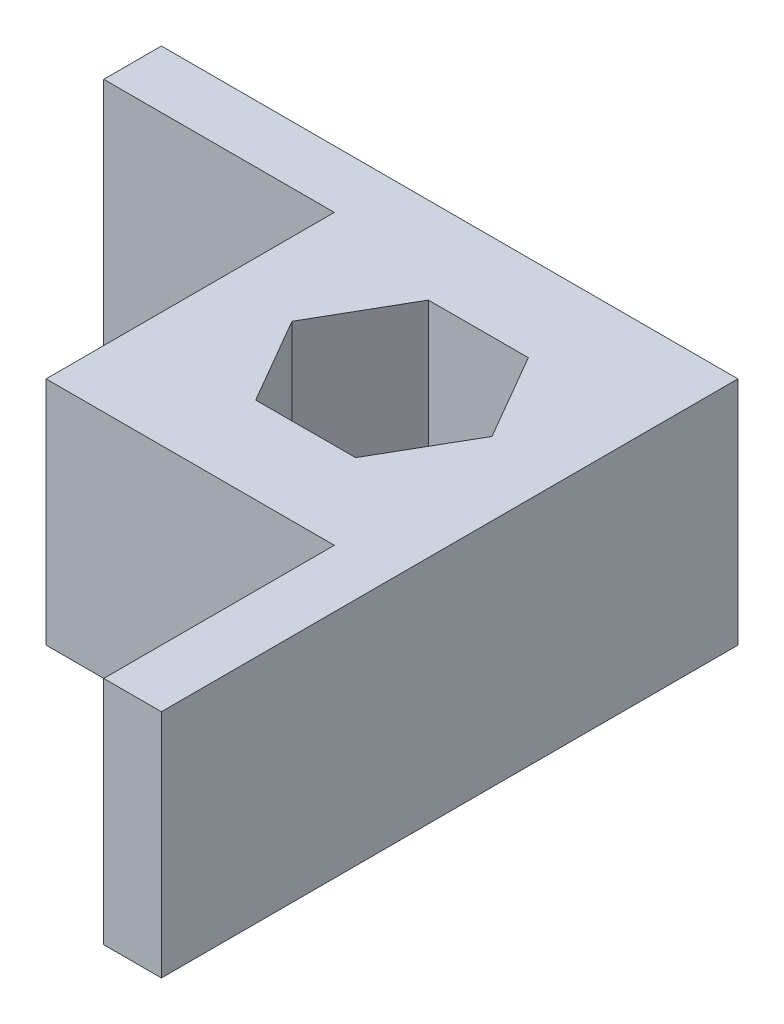
ISO-10303-21;
HEADER;
FILE_DESCRIPTION(('STEP AP214'),'2;1');
FILE_NAME('part.step','',(''),(''),'','','');
FILE_SCHEMA(('AUTOMOTIVE_DESIGN { 1 0 10303 214 1 1 1 1 }'));
ENDSEC;
DATA;
#1=APPLICATION_CONTEXT('core data for automotive mechanical design processes');
#2=APPLICATION_PROTOCOL_DEFINITION('international standard','automotive_design',2000,#1);
#3=PRODUCT_CONTEXT('',#1,'mechanical');
#4=PRODUCT('Part','Part','',(#3));
#5=PRODUCT_RELATED_PRODUCT_CATEGORY('part','',(#4));
#6=PRODUCT_DEFINITION_FORMATION('','',#4);
#7=PRODUCT_DEFINITION_CONTEXT('part definition',#1,'design');
#8=PRODUCT_DEFINITION('design','',#6,#7);
#9=PRODUCT_DEFINITION_SHAPE('','',#8);
#10=(LENGTH_UNIT() NAMED_UNIT(*) SI_UNIT(.MILLI.,.METRE.));
#11=(NAMED_UNIT(*) PLANE_ANGLE_UNIT() SI_UNIT($,.RADIAN.));
#12=(NAMED_UNIT(*) SI_UNIT($,.STERADIAN.) SOLID_ANGLE_UNIT());
#13=UNCERTAINTY_MEASURE_WITH_UNIT(LENGTH_MEASURE(1.E-05),#10,'distance_accuracy_value','');
#14=(GEOMETRIC_REPRESENTATION_CONTEXT(3) GLOBAL_UNCERTAINTY_ASSIGNED_CONTEXT((#13)) GLOBAL_UNIT_ASSIGNED_CONTEXT((#10,
#11,#12)) REPRESENTATION_CONTEXT('',''));
#15=CARTESIAN_POINT('',(0.,0.,0.));
#16=DIRECTION('',(0.,0.,1.));
#17=DIRECTION('',(1.,0.,0.));
#18=AXIS2_PLACEMENT_3D('',#15,#16,#17);
#19=CARTESIAN_POINT('',(0.,20.,5.));
#20=DIRECTION('',(1.,0.,0.));
#21=DIRECTION('',(0.,0.,-1.));
#22=AXIS2_PLACEMENT_3D('',#19,#20,#21);
#23=PLANE('',#22);
#24=DIRECTION('',(0.,0.,1.));
#25=VECTOR('',#24,1.);
#26=CARTESIAN_POINT('',(0.,0.,5.));
#27=LINE('',#26,#25);
#28=CARTESIAN_POINT('',(0.,0.,0.));
#29=VERTEX_POINT('',#28);
#30=CARTESIAN_POINT('',(0.,0.,5.));
#31=VERTEX_POINT('',#30);
#32=EDGE_CURVE('E199',#29,#31,#27,.T.);
#33=ORIENTED_EDGE('',*,*,#32,.T.);
#34=DIRECTION('',(0.,-1.,0.));
#35=VECTOR('',#34,1.);
#36=CARTESIAN_POINT('',(0.,20.,5.));
#37=LINE('',#36,#35);
#38=CARTESIAN_POINT('',(0.,20.,5.));
#39=VERTEX_POINT('',#38);
#40=EDGE_CURVE('E11',#39,#31,#37,.T.);
#41=ORIENTED_EDGE('',*,*,#40,.F.);
#42=DIRECTION('',(0.,0.,1.));
#43=VECTOR('',#42,1.);
#44=CARTESIAN_POINT('',(0.,20.,5.));
#45=LINE('',#44,#43);
#46=CARTESIAN_POINT('',(0.,20.,0.));
#47=VERTEX_POINT('',#46);
#48=EDGE_CURVE('E211',#47,#39,#45,.T.);
#49=ORIENTED_EDGE('',*,*,#48,.F.);
#50=DIRECTION('',(0.,-1.,0.));
#51=VECTOR('',#50,1.);
#52=CARTESIAN_POINT('',(0.,20.,0.));
#53=LINE('',#52,#51);
#54=EDGE_CURVE('E237',#47,#29,#53,.T.);
#55=ORIENTED_EDGE('',*,*,#54,.T.);
#56=EDGE_LOOP('',(#33,#41,#49,#55));
#57=FACE_BOUND('',#56,.T.);
#58=ADVANCED_FACE('F39',(#57),#23,.F.);
#59=CARTESIAN_POINT('',(20.,20.,5.));
#60=DIRECTION('',(0.,0.,-1.));
#61=DIRECTION('',(-1.,0.,0.));
#62=AXIS2_PLACEMENT_3D('',#59,#60,#61);
#63=PLANE('',#62);
#64=DIRECTION('',(1.,0.,0.));
#65=VECTOR('',#64,1.);
#66=CARTESIAN_POINT('',(20.,0.,5.));
#67=LINE('',#66,#65);
#68=CARTESIAN_POINT('',(20.,0.,5.));
#69=VERTEX_POINT('',#68);
#70=EDGE_CURVE('E241',#31,#69,#67,.T.);
#71=ORIENTED_EDGE('',*,*,#70,.T.);
#72=DIRECTION('',(0.,-1.,0.));
#73=VECTOR('',#72,1.);
#74=CARTESIAN_POINT('',(20.,20.,5.));
#75=LINE('',#74,#73);
#76=CARTESIAN_POINT('',(20.,20.,5.));
#77=VERTEX_POINT('',#76);
#78=EDGE_CURVE('E47',#77,#69,#75,.T.);
#79=ORIENTED_EDGE('',*,*,#78,.F.);
#80=DIRECTION('',(1.,0.,0.));
#81=VECTOR('',#80,1.);
#82=CARTESIAN_POINT('',(20.,20.,5.));
#83=LINE('',#82,#81);
#84=EDGE_CURVE('E215',#39,#77,#83,.T.);
#85=ORIENTED_EDGE('',*,*,#84,.F.);
#86=ORIENTED_EDGE('',*,*,#40,.T.);
#87=EDGE_LOOP('',(#71,#79,#85,#86));
#88=FACE_BOUND('',#87,.T.);
#89=ADVANCED_FACE('F310',(#88),#63,.F.);
#90=CARTESIAN_POINT('',(20.,20.,30.));
#91=DIRECTION('',(1.,0.,0.));
#92=DIRECTION('',(0.,0.,-1.));
#93=AXIS2_PLACEMENT_3D('',#90,#91,#92);
#94=PLANE('',#93);
#95=DIRECTION('',(0.,0.,1.));
#96=VECTOR('',#95,1.);
#97=CARTESIAN_POINT('',(20.,0.,30.));
#98=LINE('',#97,#96);
#99=CARTESIAN_POINT('',(20.,0.,30.));
#100=VERTEX_POINT('',#99);
#101=EDGE_CURVE('E244',#69,#100,#98,.T.);
#102=ORIENTED_EDGE('',*,*,#101,.T.);
#103=DIRECTION('',(0.,-1.,0.));
#104=VECTOR('',#103,1.);
#105=CARTESIAN_POINT('',(20.,20.,30.));
#106=LINE('',#105,#104);
#107=CARTESIAN_POINT('',(20.,20.,30.));
#108=VERTEX_POINT('',#107);
#109=EDGE_CURVE('E280',#108,#100,#106,.T.);
#110=ORIENTED_EDGE('',*,*,#109,.F.);
#111=DIRECTION('',(0.,0.,1.));
#112=VECTOR('',#111,1.);
#113=CARTESIAN_POINT('',(20.,20.,30.));
#114=LINE('',#113,#112);
#115=EDGE_CURVE('E219',#77,#108,#114,.T.);
#116=ORIENTED_EDGE('',*,*,#115,.F.);
#117=ORIENTED_EDGE('',*,*,#78,.T.);
#118=EDGE_LOOP('',(#102,#110,#116,#117));
#119=FACE_BOUND('',#118,.T.);
#120=ADVANCED_FACE('F289',(#119),#94,.F.);
#121=CARTESIAN_POINT('',(45.,20.,30.));
#122=DIRECTION('',(0.,0.,-1.));
#123=DIRECTION('',(-1.,0.,0.));
#124=AXIS2_PLACEMENT_3D('',#121,#122,#123);
#125=PLANE('',#124);
#126=DIRECTION('',(1.,0.,0.));
#127=VECTOR('',#126,1.);
#128=CARTESIAN_POINT('',(45.,0.,30.));
#129=LINE('',#128,#127);
#130=CARTESIAN_POINT('',(45.,0.,30.));
#131=VERTEX_POINT('',#130);
#132=EDGE_CURVE('E247',#100,#131,#129,.T.);
#133=ORIENTED_EDGE('',*,*,#132,.T.);
#134=DIRECTION('',(0.,-1.,0.));
#135=VECTOR('',#134,1.);
#136=CARTESIAN_POINT('',(45.,20.,30.));
#137=LINE('',#136,#135);
#138=CARTESIAN_POINT('',(45.,20.,30.));
#139=VERTEX_POINT('',#138);
#140=EDGE_CURVE('E276',#139,#131,#137,.T.);
#141=ORIENTED_EDGE('',*,*,#140,.F.);
#142=DIRECTION('',(1.,0.,0.));
#143=VECTOR('',#142,1.);
#144=CARTESIAN_POINT('',(45.,20.,30.));
#145=LINE('',#144,#143);
#146=EDGE_CURVE('E222',#108,#139,#145,.T.);
#147=ORIENTED_EDGE('',*,*,#146,.F.);
#148=ORIENTED_EDGE('',*,*,#109,.T.);
#149=EDGE_LOOP('',(#133,#141,#147,#148));
#150=FACE_BOUND('',#149,.T.);
#151=ADVANCED_FACE('F298',(#150),#125,.F.);
#152=CARTESIAN_POINT('',(45.,20.,50.));
#153=DIRECTION('',(1.,0.,0.));
#154=DIRECTION('',(0.,0.,-1.));
#155=AXIS2_PLACEMENT_3D('',#152,#153,#154);
#156=PLANE('',#155);
#157=DIRECTION('',(0.,0.,1.));
#158=VECTOR('',#157,1.);
#159=CARTESIAN_POINT('',(45.,0.,50.));
#160=LINE('',#159,#158);
#161=CARTESIAN_POINT('',(45.,0.,50.));
#162=VERTEX_POINT('',#161);
#163=EDGE_CURVE('E250',#131,#162,#160,.T.);
#164=ORIENTED_EDGE('',*,*,#163,.T.);
#165=DIRECTION('',(0.,-1.,0.));
#166=VECTOR('',#165,1.);
#167=CARTESIAN_POINT('',(45.,20.,50.));
#168=LINE('',#167,#166);
#169=CARTESIAN_POINT('',(45.,20.,50.));
#170=VERTEX_POINT('',#169);
#171=EDGE_CURVE('E272',#170,#162,#168,.T.);
#172=ORIENTED_EDGE('',*,*,#171,.F.);
#173=DIRECTION('',(0.,0.,1.));
#174=VECTOR('',#173,1.);
#175=CARTESIAN_POINT('',(45.,20.,50.));
#176=LINE('',#175,#174);
#177=EDGE_CURVE('E225',#139,#170,#176,.T.);
#178=ORIENTED_EDGE('',*,*,#177,.F.);
#179=ORIENTED_EDGE('',*,*,#140,.T.);
#180=EDGE_LOOP('',(#164,#172,#178,#179));
#181=FACE_BOUND('',#180,.T.);
#182=ADVANCED_FACE('F302',(#181),#156,.F.);
#183=CARTESIAN_POINT('',(50.,20.,50.));
#184=DIRECTION('',(0.,0.,-1.));
#185=DIRECTION('',(-1.,0.,0.));
#186=AXIS2_PLACEMENT_3D('',#183,#184,#185);
#187=PLANE('',#186);
#188=DIRECTION('',(1.,0.,0.));
#189=VECTOR('',#188,1.);
#190=CARTESIAN_POINT('',(50.,0.,50.));
#191=LINE('',#190,#189);
#192=CARTESIAN_POINT('',(50.,0.,50.));
#193=VERTEX_POINT('',#192);
#194=EDGE_CURVE('E253',#162,#193,#191,.T.);
#195=ORIENTED_EDGE('',*,*,#194,.T.);
#196=DIRECTION('',(0.,-1.,0.));
#197=VECTOR('',#196,1.);
#198=CARTESIAN_POINT('',(50.,20.,50.));
#199=LINE('',#198,#197);
#200=CARTESIAN_POINT('',(50.,20.,50.));
#201=VERTEX_POINT('',#200);
#202=EDGE_CURVE('E268',#201,#193,#199,.T.);
#203=ORIENTED_EDGE('',*,*,#202,.F.);
#204=DIRECTION('',(1.,0.,0.));
#205=VECTOR('',#204,1.);
#206=CARTESIAN_POINT('',(50.,20.,50.));
#207=LINE('',#206,#205);
#208=EDGE_CURVE('E228',#170,#201,#207,.T.);
#209=ORIENTED_EDGE('',*,*,#208,.F.);
#210=ORIENTED_EDGE('',*,*,#171,.T.);
#211=EDGE_LOOP('',(#195,#203,#209,#210));
#212=FACE_BOUND('',#211,.T.);
#213=ADVANCED_FACE('F323',(#212),#187,.F.);
#214=CARTESIAN_POINT('',(50.,20.,0.));
#215=DIRECTION('',(-1.,0.,0.));
#216=DIRECTION('',(0.,0.,1.));
#217=AXIS2_PLACEMENT_3D('',#214,#215,#216);
#218=PLANE('',#217);
#219=DIRECTION('',(0.,0.,-1.));
#220=VECTOR('',#219,1.);
#221=CARTESIAN_POINT('',(50.,0.,0.));
#222=LINE('',#221,#220);
#223=CARTESIAN_POINT('',(50.,0.,0.));
#224=VERTEX_POINT('',#223);
#225=EDGE_CURVE('E256',#193,#224,#222,.T.);
#226=ORIENTED_EDGE('',*,*,#225,.T.);
#227=DIRECTION('',(0.,-1.,0.));
#228=VECTOR('',#227,1.);
#229=CARTESIAN_POINT('',(50.,20.,0.));
#230=LINE('',#229,#228);
#231=CARTESIAN_POINT('',(50.,20.,0.));
#232=VERTEX_POINT('',#231);
#233=EDGE_CURVE('E264',#232,#224,#230,.T.);
#234=ORIENTED_EDGE('',*,*,#233,.F.);
#235=DIRECTION('',(0.,0.,-1.));
#236=VECTOR('',#235,1.);
#237=CARTESIAN_POINT('',(50.,20.,0.));
#238=LINE('',#237,#236);
#239=EDGE_CURVE('E231',#201,#232,#238,.T.);
#240=ORIENTED_EDGE('',*,*,#239,.F.);
#241=ORIENTED_EDGE('',*,*,#202,.T.);
#242=EDGE_LOOP('',(#226,#234,#240,#241));
#243=FACE_BOUND('',#242,.T.);
#244=ADVANCED_FACE('F321',(#243),#218,.F.);
#245=CARTESIAN_POINT('',(0.,20.,0.));
#246=DIRECTION('',(0.,0.,1.));
#247=DIRECTION('',(1.,0.,0.));
#248=AXIS2_PLACEMENT_3D('',#245,#246,#247);
#249=PLANE('',#248);
#250=DIRECTION('',(-1.,0.,0.));
#251=VECTOR('',#250,1.);
#252=CARTESIAN_POINT('',(0.,0.,0.));
#253=LINE('',#252,#251);
#254=EDGE_CURVE('E216',#224,#29,#253,.T.);
#255=ORIENTED_EDGE('',*,*,#254,.T.);
#256=ORIENTED_EDGE('',*,*,#54,.F.);
#257=DIRECTION('',(-1.,0.,0.));
#258=VECTOR('',#257,1.);
#259=CARTESIAN_POINT('',(0.,20.,0.));
#260=LINE('',#259,#258);
#261=EDGE_CURVE('E234',#232,#47,#260,.T.);
#262=ORIENTED_EDGE('',*,*,#261,.F.);
#263=ORIENTED_EDGE('',*,*,#233,.T.);
#264=EDGE_LOOP('',(#255,#256,#262,#263));
#265=FACE_BOUND('',#264,.T.);
#266=ADVANCED_FACE('F316',(#265),#249,.F.);
#267=CARTESIAN_POINT('',(0.,20.,0.));
#268=DIRECTION('',(0.,-1.,0.));
#269=DIRECTION('',(0.,0.,-1.));
#270=AXIS2_PLACEMENT_3D('',#267,#268,#269);
#271=PLANE('',#270);
#272=DIRECTION('',(0.498715571278608,0.,-0.86676570015446));
#273=VECTOR('',#272,1.);
#274=CARTESIAN_POINT('',(39.3412409812078,20.,22.4935723619034));
#275=LINE('',#274,#273);
#276=CARTESIAN_POINT('',(39.3412409812077,20.,22.4935723619034));
#277=VERTEX_POINT('',#276);
#278=CARTESIAN_POINT('',(43.6602445211092,20.,14.9871612072757));
#279=VERTEX_POINT('',#278);
#280=EDGE_CURVE('E182',#277,#279,#275,.T.);
#281=ORIENTED_EDGE('',*,*,#280,.F.);
#282=DIRECTION('',(0.999998901102072,0.,-0.00148249608708693));
#283=VECTOR('',#282,1.);
#284=CARTESIAN_POINT('',(30.6809964600986,20.,22.5064111546277));
#285=LINE('',#284,#283);
#286=CARTESIAN_POINT('',(30.6809964600986,20.,22.5064111546277));
#287=VERTEX_POINT('',#286);
#288=EDGE_CURVE('E54',#287,#277,#285,.T.);
#289=ORIENTED_EDGE('',*,*,#288,.F.);
#290=DIRECTION('',(0.501283329823464,0.,0.865283204067373));
#291=VECTOR('',#290,1.);
#292=CARTESIAN_POINT('',(26.3397554788908,20.,15.0128387927243));
#293=LINE('',#292,#291);
#294=CARTESIAN_POINT('',(26.3397554788908,20.,15.0128387927243));
#295=VERTEX_POINT('',#294);
#296=EDGE_CURVE('E162',#295,#287,#293,.T.);
#297=ORIENTED_EDGE('',*,*,#296,.F.);
#298=DIRECTION('',(-0.498715571278608,0.,0.86676570015446));
#299=VECTOR('',#298,1.);
#300=CARTESIAN_POINT('',(30.6587590187922,20.,7.50642763809656));
#301=LINE('',#300,#299);
#302=CARTESIAN_POINT('',(30.6587590187922,20.,7.50642763809656));
#303=VERTEX_POINT('',#302);
#304=EDGE_CURVE('E166',#303,#295,#301,.T.);
#305=ORIENTED_EDGE('',*,*,#304,.F.);
#306=DIRECTION('',(-0.999998901102072,0.,0.00148249608708653));
#307=VECTOR('',#306,1.);
#308=CARTESIAN_POINT('',(39.3190035399015,20.,7.49358884537228));
#309=LINE('',#308,#307);
#310=CARTESIAN_POINT('',(39.3190035399015,20.,7.49358884537228));
#311=VERTEX_POINT('',#310);
#312=EDGE_CURVE('E189',#311,#303,#309,.T.);
#313=ORIENTED_EDGE('',*,*,#312,.F.);
#314=DIRECTION('',(-0.501283329823464,0.,-0.865283204067373));
#315=VECTOR('',#314,1.);
#316=CARTESIAN_POINT('',(43.6602445211092,20.,14.9871612072757));
#317=LINE('',#316,#315);
#318=EDGE_CURVE('E185',#279,#311,#317,.T.);
#319=ORIENTED_EDGE('',*,*,#318,.F.);
#320=EDGE_LOOP('',(#281,#289,#297,#305,#313,#319));
#321=FACE_BOUND('',#320,.T.);
#322=ORIENTED_EDGE('',*,*,#48,.T.);
#323=ORIENTED_EDGE('',*,*,#84,.T.);
#324=ORIENTED_EDGE('',*,*,#115,.T.);
#325=ORIENTED_EDGE('',*,*,#146,.T.);
#326=ORIENTED_EDGE('',*,*,#177,.T.);
#327=ORIENTED_EDGE('',*,*,#208,.T.);
#328=ORIENTED_EDGE('',*,*,#239,.T.);
#329=ORIENTED_EDGE('',*,*,#261,.T.);
#330=EDGE_LOOP('',(#322,#323,#324,#325,#326,#327,#328,#329));
#331=FACE_BOUND('',#330,.T.);
#332=ADVANCED_FACE('F306',(#321,#331),#271,.F.);
#333=CARTESIAN_POINT('',(0.,0.,0.));
#334=DIRECTION('',(0.,-1.,0.));
#335=DIRECTION('',(0.,0.,-1.));
#336=AXIS2_PLACEMENT_3D('',#333,#334,#335);
#337=PLANE('',#336);
#338=DIRECTION('',(0.999998901102072,0.,-0.00148249608708693));
#339=VECTOR('',#338,1.);
#340=CARTESIAN_POINT('',(30.6809964600986,0.,22.5064111546277));
#341=LINE('',#340,#339);
#342=CARTESIAN_POINT('',(30.6809964600986,0.,22.5064111546277));
#343=VERTEX_POINT('',#342);
#344=CARTESIAN_POINT('',(39.3412409812078,0.,22.4935723619034));
#345=VERTEX_POINT('',#344);
#346=EDGE_CURVE('E142',#343,#345,#341,.T.);
#347=ORIENTED_EDGE('',*,*,#346,.T.);
#348=DIRECTION('',(0.498715571278608,0.,-0.86676570015446));
#349=VECTOR('',#348,1.);
#350=CARTESIAN_POINT('',(39.3412409812078,0.,22.4935723619034));
#351=LINE('',#350,#349);
#352=CARTESIAN_POINT('',(43.6602445211092,0.,14.9871612072757));
#353=VERTEX_POINT('',#352);
#354=EDGE_CURVE('E152',#345,#353,#351,.T.);
#355=ORIENTED_EDGE('',*,*,#354,.T.);
#356=DIRECTION('',(-0.501283329823464,0.,-0.865283204067373));
#357=VECTOR('',#356,1.);
#358=CARTESIAN_POINT('',(43.6602445211092,0.,14.9871612072757));
#359=LINE('',#358,#357);
#360=CARTESIAN_POINT('',(39.3190035399015,0.,7.49358884537228));
#361=VERTEX_POINT('',#360);
#362=EDGE_CURVE('E62',#353,#361,#359,.T.);
#363=ORIENTED_EDGE('',*,*,#362,.T.);
#364=DIRECTION('',(-0.999998901102072,0.,0.00148249608708653));
#365=VECTOR('',#364,1.);
#366=CARTESIAN_POINT('',(39.3190035399015,0.,7.49358884537228));
#367=LINE('',#366,#365);
#368=CARTESIAN_POINT('',(30.6587590187922,0.,7.50642763809656));
#369=VERTEX_POINT('',#368);
#370=EDGE_CURVE('E171',#361,#369,#367,.T.);
#371=ORIENTED_EDGE('',*,*,#370,.T.);
#372=DIRECTION('',(-0.498715571278608,0.,0.86676570015446));
#373=VECTOR('',#372,1.);
#374=CARTESIAN_POINT('',(30.6587590187922,0.,7.50642763809656));
#375=LINE('',#374,#373);
#376=CARTESIAN_POINT('',(26.3397554788908,0.,15.0128387927243));
#377=VERTEX_POINT('',#376);
#378=EDGE_CURVE('E175',#369,#377,#375,.T.);
#379=ORIENTED_EDGE('',*,*,#378,.T.);
#380=DIRECTION('',(0.501283329823464,0.,0.865283204067373));
#381=VECTOR('',#380,1.);
#382=CARTESIAN_POINT('',(26.3397554788908,0.,15.0128387927243));
#383=LINE('',#382,#381);
#384=EDGE_CURVE('E149',#377,#343,#383,.T.);
#385=ORIENTED_EDGE('',*,*,#384,.T.);
#386=EDGE_LOOP('',(#347,#355,#363,#371,#379,#385));
#387=FACE_BOUND('',#386,.T.);
#388=ORIENTED_EDGE('',*,*,#32,.F.);
#389=ORIENTED_EDGE('',*,*,#254,.F.);
#390=ORIENTED_EDGE('',*,*,#225,.F.);
#391=ORIENTED_EDGE('',*,*,#194,.F.);
#392=ORIENTED_EDGE('',*,*,#163,.F.);
#393=ORIENTED_EDGE('',*,*,#132,.F.);
#394=ORIENTED_EDGE('',*,*,#101,.F.);
#395=ORIENTED_EDGE('',*,*,#70,.F.);
#396=EDGE_LOOP('',(#388,#389,#390,#391,#392,#393,#394,#395));
#397=FACE_BOUND('',#396,.T.);
#398=ADVANCED_FACE('F157',(#387,#397),#337,.T.);
#399=CARTESIAN_POINT('',(30.6809964600986,0.,22.5064111546277));
#400=DIRECTION('',(0.00148249608708693,0.,0.999998901102072));
#401=DIRECTION('',(0.999998901102072,0.,-0.00148249608708693));
#402=AXIS2_PLACEMENT_3D('',#399,#400,#401);
#403=PLANE('',#402);
#404=ORIENTED_EDGE('',*,*,#288,.T.);
#405=DIRECTION('',(0.,1.,0.));
#406=VECTOR('',#405,1.);
#407=CARTESIAN_POINT('',(39.3412409812078,0.,22.4935723619034));
#408=LINE('',#407,#406);
#409=EDGE_CURVE('E138',#345,#277,#408,.T.);
#410=ORIENTED_EDGE('',*,*,#409,.F.);
#411=ORIENTED_EDGE('',*,*,#346,.F.);
#412=DIRECTION('',(0.,1.,0.));
#413=VECTOR('',#412,1.);
#414=CARTESIAN_POINT('',(30.6809964600986,0.,22.5064111546277));
#415=LINE('',#414,#413);
#416=EDGE_CURVE('E196',#343,#287,#415,.T.);
#417=ORIENTED_EDGE('',*,*,#416,.T.);
#418=EDGE_LOOP('',(#404,#410,#411,#417));
#419=FACE_BOUND('',#418,.T.);
#420=ADVANCED_FACE('F140',(#419),#403,.F.);
#421=CARTESIAN_POINT('',(26.3397554788908,0.,15.0128387927243));
#422=DIRECTION('',(-0.865283204067374,0.,0.501283329823464));
#423=DIRECTION('',(0.501283329823464,0.,0.865283204067374));
#424=AXIS2_PLACEMENT_3D('',#421,#422,#423);
#425=PLANE('',#424);
#426=ORIENTED_EDGE('',*,*,#296,.T.);
#427=ORIENTED_EDGE('',*,*,#416,.F.);
#428=ORIENTED_EDGE('',*,*,#384,.F.);
#429=DIRECTION('',(0.,1.,0.));
#430=VECTOR('',#429,1.);
#431=CARTESIAN_POINT('',(26.3397554788908,0.,15.0128387927243));
#432=LINE('',#431,#430);
#433=EDGE_CURVE('E200',#377,#295,#432,.T.);
#434=ORIENTED_EDGE('',*,*,#433,.T.);
#435=EDGE_LOOP('',(#426,#427,#428,#434));
#436=FACE_BOUND('',#435,.T.);
#437=ADVANCED_FACE('F394',(#436),#425,.F.);
#438=CARTESIAN_POINT('',(30.6587590187922,0.,7.50642763809656));
#439=DIRECTION('',(-0.86676570015446,0.,-0.498715571278608));
#440=DIRECTION('',(-0.498715571278608,0.,0.86676570015446));
#441=AXIS2_PLACEMENT_3D('',#438,#439,#440);
#442=PLANE('',#441);
#443=ORIENTED_EDGE('',*,*,#304,.T.);
#444=ORIENTED_EDGE('',*,*,#433,.F.);
#445=ORIENTED_EDGE('',*,*,#378,.F.);
#446=DIRECTION('',(0.,1.,0.));
#447=VECTOR('',#446,1.);
#448=CARTESIAN_POINT('',(30.6587590187922,0.,7.50642763809656));
#449=LINE('',#448,#447);
#450=EDGE_CURVE('E203',#369,#303,#449,.T.);
#451=ORIENTED_EDGE('',*,*,#450,.T.);
#452=EDGE_LOOP('',(#443,#444,#445,#451));
#453=FACE_BOUND('',#452,.T.);
#454=ADVANCED_FACE('F403',(#453),#442,.F.);
#455=CARTESIAN_POINT('',(39.3190035399015,0.,7.49358884537228));
#456=DIRECTION('',(-0.00148249608708653,0.,-0.999998901102072));
#457=DIRECTION('',(-0.999998901102072,0.,0.00148249608708653));
#458=AXIS2_PLACEMENT_3D('',#455,#456,#457);
#459=PLANE('',#458);
#460=ORIENTED_EDGE('',*,*,#312,.T.);
#461=ORIENTED_EDGE('',*,*,#450,.F.);
#462=ORIENTED_EDGE('',*,*,#370,.F.);
#463=DIRECTION('',(0.,1.,0.));
#464=VECTOR('',#463,1.);
#465=CARTESIAN_POINT('',(39.3190035399015,0.,7.49358884537228));
#466=LINE('',#465,#464);
#467=EDGE_CURVE('E206',#361,#311,#466,.T.);
#468=ORIENTED_EDGE('',*,*,#467,.T.);
#469=EDGE_LOOP('',(#460,#461,#462,#468));
#470=FACE_BOUND('',#469,.T.);
#471=ADVANCED_FACE('F413',(#470),#459,.F.);
#472=CARTESIAN_POINT('',(43.6602445211092,0.,14.9871612072757));
#473=DIRECTION('',(0.865283204067373,0.,-0.501283329823464));
#474=DIRECTION('',(-0.501283329823465,0.,-0.865283204067373));
#475=AXIS2_PLACEMENT_3D('',#472,#473,#474);
#476=PLANE('',#475);
#477=ORIENTED_EDGE('',*,*,#318,.T.);
#478=ORIENTED_EDGE('',*,*,#467,.F.);
#479=ORIENTED_EDGE('',*,*,#362,.F.);
#480=DIRECTION('',(0.,1.,0.));
#481=VECTOR('',#480,1.);
#482=CARTESIAN_POINT('',(43.6602445211092,0.,14.9871612072757));
#483=LINE('',#482,#481);
#484=EDGE_CURVE('E148',#353,#279,#483,.T.);
#485=ORIENTED_EDGE('',*,*,#484,.T.);
#486=EDGE_LOOP('',(#477,#478,#479,#485));
#487=FACE_BOUND('',#486,.T.);
#488=ADVANCED_FACE('F423',(#487),#476,.F.);
#489=CARTESIAN_POINT('',(39.3412409812078,0.,22.4935723619034));
#490=DIRECTION('',(0.86676570015446,0.,0.498715571278608));
#491=DIRECTION('',(0.498715571278608,0.,-0.86676570015446));
#492=AXIS2_PLACEMENT_3D('',#489,#490,#491);
#493=PLANE('',#492);
#494=ORIENTED_EDGE('',*,*,#280,.T.);
#495=ORIENTED_EDGE('',*,*,#484,.F.);
#496=ORIENTED_EDGE('',*,*,#354,.F.);
#497=ORIENTED_EDGE('',*,*,#409,.T.);
#498=EDGE_LOOP('',(#494,#495,#496,#497));
#499=FACE_BOUND('',#498,.T.);
#500=ADVANCED_FACE('F153',(#499),#493,.F.);
#501=CLOSED_SHELL('',(#58,#89,#120,#151,#182,#213,#244,#266,#332,#398,#420,#437,#454,#471,#488,#500));
#502=MANIFOLD_SOLID_BREP('B2',#501);
#503=ADVANCED_BREP_SHAPE_REPRESENTATION('',(#18,#502),#14);
#504=SHAPE_DEFINITION_REPRESENTATION(#9,#503);
ENDSEC;
END-ISO-10303-21;
